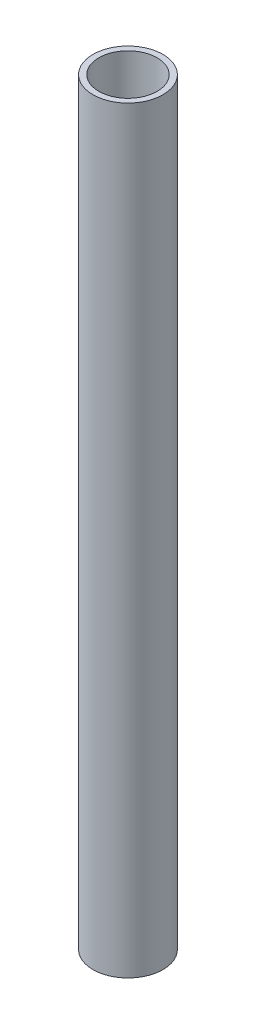
ISO-10303-21;
HEADER;
FILE_DESCRIPTION(('STEP AP214'),'2;1');
FILE_NAME('part.step','',(''),(''),'','','');
FILE_SCHEMA(('AUTOMOTIVE_DESIGN { 1 0 10303 214 1 1 1 1 }'));
ENDSEC;
DATA;
#1=APPLICATION_CONTEXT('core data for automotive mechanical design processes');
#2=APPLICATION_PROTOCOL_DEFINITION('international standard','automotive_design',2000,#1);
#3=PRODUCT_CONTEXT('',#1,'mechanical');
#4=PRODUCT('Part','Part','',(#3));
#5=PRODUCT_RELATED_PRODUCT_CATEGORY('part','',(#4));
#6=PRODUCT_DEFINITION_FORMATION('','',#4);
#7=PRODUCT_DEFINITION_CONTEXT('part definition',#1,'design');
#8=PRODUCT_DEFINITION('design','',#6,#7);
#9=PRODUCT_DEFINITION_SHAPE('','',#8);
#10=(LENGTH_UNIT() NAMED_UNIT(*) SI_UNIT(.MILLI.,.METRE.));
#11=(NAMED_UNIT(*) PLANE_ANGLE_UNIT() SI_UNIT($,.RADIAN.));
#12=(NAMED_UNIT(*) SI_UNIT($,.STERADIAN.) SOLID_ANGLE_UNIT());
#13=UNCERTAINTY_MEASURE_WITH_UNIT(LENGTH_MEASURE(1.E-05),#10,'distance_accuracy_value','');
#14=(GEOMETRIC_REPRESENTATION_CONTEXT(3) GLOBAL_UNCERTAINTY_ASSIGNED_CONTEXT((#13)) GLOBAL_UNIT_ASSIGNED_CONTEXT((#10,
#11,#12)) REPRESENTATION_CONTEXT('',''));
#15=CARTESIAN_POINT('',(0.,0.,0.));
#16=DIRECTION('',(0.,0.,1.));
#17=DIRECTION('',(1.,0.,0.));
#18=AXIS2_PLACEMENT_3D('',#15,#16,#17);
#19=CARTESIAN_POINT('',(0.,130.,0.));
#20=DIRECTION('',(0.,1.,0.));
#21=DIRECTION('',(0.,0.,1.));
#22=AXIS2_PLACEMENT_3D('',#19,#20,#21);
#23=PLANE('',#22);
#24=CARTESIAN_POINT('',(0.,130.,0.));
#25=DIRECTION('',(0.,1.,0.));
#26=DIRECTION('',(0.,0.,1.));
#27=AXIS2_PLACEMENT_3D('',#24,#25,#26);
#28=CIRCLE('',#27,6.);
#29=CARTESIAN_POINT('',(0.,130.,6.));
#30=VERTEX_POINT('',#29);
#31=EDGE_CURVE('E11',#30,#30,#28,.T.);
#32=ORIENTED_EDGE('',*,*,#31,.T.);
#33=EDGE_LOOP('',(#32));
#34=FACE_BOUND('',#33,.T.);
#35=CARTESIAN_POINT('',(0.,130.,0.));
#36=DIRECTION('',(0.,1.,0.));
#37=DIRECTION('',(1.,0.,0.));
#38=AXIS2_PLACEMENT_3D('',#35,#36,#37);
#39=CIRCLE('',#38,5.);
#40=CARTESIAN_POINT('',(5.,130.,0.));
#41=VERTEX_POINT('',#40);
#42=EDGE_CURVE('E56',#41,#41,#39,.T.);
#43=ORIENTED_EDGE('',*,*,#42,.F.);
#44=EDGE_LOOP('',(#43));
#45=FACE_BOUND('',#44,.T.);
#46=ADVANCED_FACE('F43',(#34,#45),#23,.T.);
#47=CARTESIAN_POINT('',(0.,0.,0.));
#48=DIRECTION('',(0.,1.,0.));
#49=DIRECTION('',(0.,0.,1.));
#50=AXIS2_PLACEMENT_3D('',#47,#48,#49);
#51=PLANE('',#50);
#52=CARTESIAN_POINT('',(0.,0.,0.));
#53=DIRECTION('',(0.,1.,0.));
#54=DIRECTION('',(0.,0.,1.));
#55=AXIS2_PLACEMENT_3D('',#52,#53,#54);
#56=CIRCLE('',#55,6.);
#57=CARTESIAN_POINT('',(0.,0.,6.));
#58=VERTEX_POINT('',#57);
#59=EDGE_CURVE('E47',#58,#58,#56,.T.);
#60=ORIENTED_EDGE('',*,*,#59,.F.);
#61=EDGE_LOOP('',(#60));
#62=FACE_BOUND('',#61,.T.);
#63=CARTESIAN_POINT('',(0.,0.,0.));
#64=DIRECTION('',(0.,1.,0.));
#65=DIRECTION('',(1.,0.,0.));
#66=AXIS2_PLACEMENT_3D('',#63,#64,#65);
#67=CIRCLE('',#66,5.);
#68=CARTESIAN_POINT('',(5.,0.,0.));
#69=VERTEX_POINT('',#68);
#70=EDGE_CURVE('E58',#69,#69,#67,.T.);
#71=ORIENTED_EDGE('',*,*,#70,.T.);
#72=EDGE_LOOP('',(#71));
#73=FACE_BOUND('',#72,.T.);
#74=ADVANCED_FACE('F70',(#62,#73),#51,.F.);
#75=CARTESIAN_POINT('',(0.,130.,0.));
#76=DIRECTION('',(0.,-1.,0.));
#77=DIRECTION('',(0.,0.,-1.));
#78=AXIS2_PLACEMENT_3D('',#75,#76,#77);
#79=CYLINDRICAL_SURFACE('',#78,6.);
#80=ORIENTED_EDGE('',*,*,#31,.F.);
#81=EDGE_LOOP('',(#80));
#82=FACE_BOUND('',#81,.T.);
#83=ORIENTED_EDGE('',*,*,#59,.T.);
#84=EDGE_LOOP('',(#83));
#85=FACE_BOUND('',#84,.T.);
#86=ADVANCED_FACE('F45',(#82,#85),#79,.T.);
#87=CARTESIAN_POINT('',(0.,130.,0.));
#88=DIRECTION('',(0.,-1.,0.));
#89=DIRECTION('',(0.,0.,-1.));
#90=AXIS2_PLACEMENT_3D('',#87,#88,#89);
#91=CYLINDRICAL_SURFACE('',#90,5.);
#92=ORIENTED_EDGE('',*,*,#42,.T.);
#93=EDGE_LOOP('',(#92));
#94=FACE_BOUND('',#93,.T.);
#95=ORIENTED_EDGE('',*,*,#70,.F.);
#96=EDGE_LOOP('',(#95));
#97=FACE_BOUND('',#96,.T.);
#98=ADVANCED_FACE('F66',(#94,#97),#91,.F.);
#99=CLOSED_SHELL('',(#46,#74,#86,#98));
#100=MANIFOLD_SOLID_BREP('B2',#99);
#101=ADVANCED_BREP_SHAPE_REPRESENTATION('',(#18,#100),#14);
#102=SHAPE_DEFINITION_REPRESENTATION(#9,#101);
ENDSEC;
END-ISO-10303-21;
